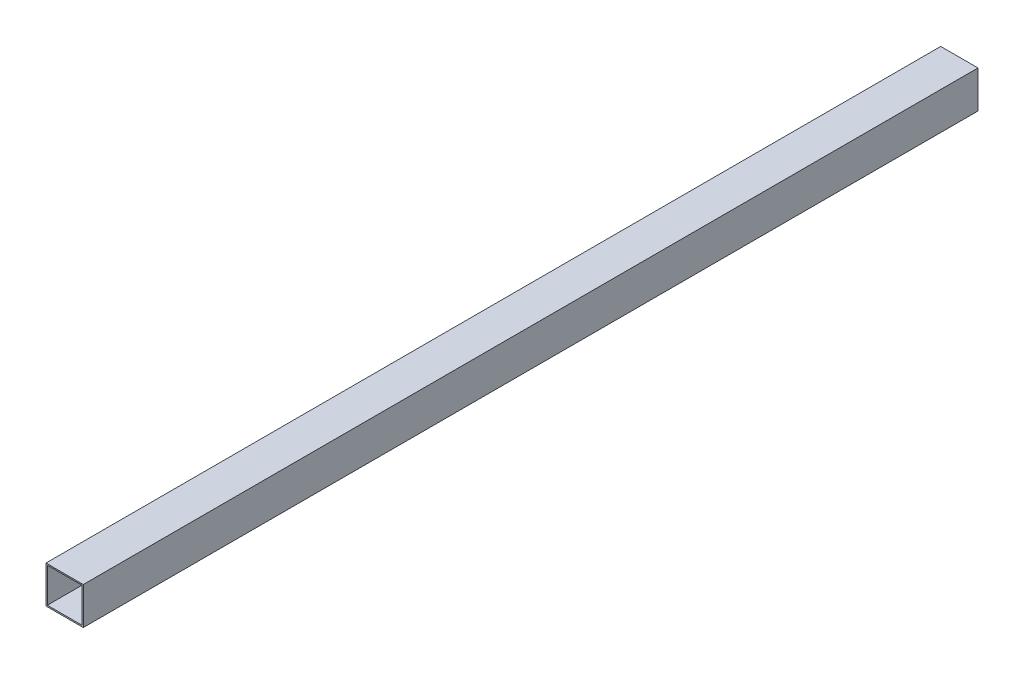
ISO-10303-21;
HEADER;
FILE_DESCRIPTION(('STEP AP214'),'2;1');
FILE_NAME('part.step','',(''),(''),'','','');
FILE_SCHEMA(('AUTOMOTIVE_DESIGN { 1 0 10303 214 1 1 1 1 }'));
ENDSEC;
DATA;
#1=APPLICATION_CONTEXT('core data for automotive mechanical design processes');
#2=APPLICATION_PROTOCOL_DEFINITION('international standard','automotive_design',2000,#1);
#3=PRODUCT_CONTEXT('',#1,'mechanical');
#4=PRODUCT('Part','Part','',(#3));
#5=PRODUCT_RELATED_PRODUCT_CATEGORY('part','',(#4));
#6=PRODUCT_DEFINITION_FORMATION('','',#4);
#7=PRODUCT_DEFINITION_CONTEXT('part definition',#1,'design');
#8=PRODUCT_DEFINITION('design','',#6,#7);
#9=PRODUCT_DEFINITION_SHAPE('','',#8);
#10=(LENGTH_UNIT() NAMED_UNIT(*) SI_UNIT(.MILLI.,.METRE.));
#11=(NAMED_UNIT(*) PLANE_ANGLE_UNIT() SI_UNIT($,.RADIAN.));
#12=(NAMED_UNIT(*) SI_UNIT($,.STERADIAN.) SOLID_ANGLE_UNIT());
#13=UNCERTAINTY_MEASURE_WITH_UNIT(LENGTH_MEASURE(1.E-05),#10,'distance_accuracy_value','');
#14=(GEOMETRIC_REPRESENTATION_CONTEXT(3) GLOBAL_UNCERTAINTY_ASSIGNED_CONTEXT((#13)) GLOBAL_UNIT_ASSIGNED_CONTEXT((#10,
#11,#12)) REPRESENTATION_CONTEXT('',''));
#15=CARTESIAN_POINT('',(0.,0.,0.));
#16=DIRECTION('',(0.,0.,1.));
#17=DIRECTION('',(1.,0.,0.));
#18=AXIS2_PLACEMENT_3D('',#15,#16,#17);
#19=CARTESIAN_POINT('',(-16.7874934818428,20.0303060807414,609.6));
#20=DIRECTION('',(1.,0.,0.));
#21=DIRECTION('',(0.,0.,-1.));
#22=AXIS2_PLACEMENT_3D('',#19,#20,#21);
#23=PLANE('',#22);
#24=DIRECTION('',(0.,-1.,0.));
#25=VECTOR('',#24,1.);
#26=CARTESIAN_POINT('',(-16.7874934818428,20.0303060807414,0.));
#27=LINE('',#26,#25);
#28=CARTESIAN_POINT('',(-16.7874934818428,20.0303060807414,0.));
#29=VERTEX_POINT('',#28);
#30=CARTESIAN_POINT('',(-16.7874934818428,-5.36969391925859,0.));
#31=VERTEX_POINT('',#30);
#32=EDGE_CURVE('E130',#29,#31,#27,.T.);
#33=ORIENTED_EDGE('',*,*,#32,.T.);
#34=DIRECTION('',(0.,0.,-1.));
#35=VECTOR('',#34,1.);
#36=CARTESIAN_POINT('',(-16.7874934818428,-5.36969391925859,609.6));
#37=LINE('',#36,#35);
#38=CARTESIAN_POINT('',(-16.7874934818428,-5.36969391925859,609.6));
#39=VERTEX_POINT('',#38);
#40=EDGE_CURVE('E11',#39,#31,#37,.T.);
#41=ORIENTED_EDGE('',*,*,#40,.F.);
#42=DIRECTION('',(0.,-1.,0.));
#43=VECTOR('',#42,1.);
#44=CARTESIAN_POINT('',(-16.7874934818428,20.0303060807414,609.6));
#45=LINE('',#44,#43);
#46=CARTESIAN_POINT('',(-16.7874934818428,20.0303060807414,609.6));
#47=VERTEX_POINT('',#46);
#48=EDGE_CURVE('E134',#47,#39,#45,.T.);
#49=ORIENTED_EDGE('',*,*,#48,.F.);
#50=DIRECTION('',(0.,0.,-1.));
#51=VECTOR('',#50,1.);
#52=CARTESIAN_POINT('',(-16.7874934818428,20.0303060807414,609.6));
#53=LINE('',#52,#51);
#54=EDGE_CURVE('E144',#47,#29,#53,.T.);
#55=ORIENTED_EDGE('',*,*,#54,.T.);
#56=EDGE_LOOP('',(#33,#41,#49,#55));
#57=FACE_BOUND('',#56,.T.);
#58=ADVANCED_FACE('F33',(#57),#23,.F.);
#59=CARTESIAN_POINT('',(-16.7874934818428,-5.36969391925859,609.6));
#60=DIRECTION('',(0.,1.,0.));
#61=DIRECTION('',(0.,0.,1.));
#62=AXIS2_PLACEMENT_3D('',#59,#60,#61);
#63=PLANE('',#62);
#64=DIRECTION('',(1.,0.,0.));
#65=VECTOR('',#64,1.);
#66=CARTESIAN_POINT('',(-16.7874934818428,-5.36969391925859,0.));
#67=LINE('',#66,#65);
#68=CARTESIAN_POINT('',(8.61250651815717,-5.36969391925859,0.));
#69=VERTEX_POINT('',#68);
#70=EDGE_CURVE('E147',#31,#69,#67,.T.);
#71=ORIENTED_EDGE('',*,*,#70,.T.);
#72=DIRECTION('',(0.,0.,-1.));
#73=VECTOR('',#72,1.);
#74=CARTESIAN_POINT('',(8.61250651815717,-5.36969391925859,609.6));
#75=LINE('',#74,#73);
#76=CARTESIAN_POINT('',(8.61250651815717,-5.36969391925859,609.6));
#77=VERTEX_POINT('',#76);
#78=EDGE_CURVE('E40',#77,#69,#75,.T.);
#79=ORIENTED_EDGE('',*,*,#78,.F.);
#80=DIRECTION('',(1.,0.,0.));
#81=VECTOR('',#80,1.);
#82=CARTESIAN_POINT('',(-16.7874934818428,-5.36969391925859,609.6));
#83=LINE('',#82,#81);
#84=EDGE_CURVE('E137',#39,#77,#83,.T.);
#85=ORIENTED_EDGE('',*,*,#84,.F.);
#86=ORIENTED_EDGE('',*,*,#40,.T.);
#87=EDGE_LOOP('',(#71,#79,#85,#86));
#88=FACE_BOUND('',#87,.T.);
#89=ADVANCED_FACE('F175',(#88),#63,.F.);
#90=CARTESIAN_POINT('',(8.61250651815717,20.0303060807414,609.6));
#91=DIRECTION('',(-1.,0.,0.));
#92=DIRECTION('',(0.,0.,1.));
#93=AXIS2_PLACEMENT_3D('',#90,#91,#92);
#94=PLANE('',#93);
#95=DIRECTION('',(0.,1.,0.));
#96=VECTOR('',#95,1.);
#97=CARTESIAN_POINT('',(8.61250651815717,20.0303060807414,0.));
#98=LINE('',#97,#96);
#99=CARTESIAN_POINT('',(8.61250651815717,20.0303060807414,0.));
#100=VERTEX_POINT('',#99);
#101=EDGE_CURVE('E149',#69,#100,#98,.T.);
#102=ORIENTED_EDGE('',*,*,#101,.T.);
#103=DIRECTION('',(0.,0.,-1.));
#104=VECTOR('',#103,1.);
#105=CARTESIAN_POINT('',(8.61250651815717,20.0303060807414,609.6));
#106=LINE('',#105,#104);
#107=CARTESIAN_POINT('',(8.61250651815717,20.0303060807414,609.6));
#108=VERTEX_POINT('',#107);
#109=EDGE_CURVE('E154',#108,#100,#106,.T.);
#110=ORIENTED_EDGE('',*,*,#109,.F.);
#111=DIRECTION('',(0.,1.,0.));
#112=VECTOR('',#111,1.);
#113=CARTESIAN_POINT('',(8.61250651815717,20.0303060807414,609.6));
#114=LINE('',#113,#112);
#115=EDGE_CURVE('E140',#77,#108,#114,.T.);
#116=ORIENTED_EDGE('',*,*,#115,.F.);
#117=ORIENTED_EDGE('',*,*,#78,.T.);
#118=EDGE_LOOP('',(#102,#110,#116,#117));
#119=FACE_BOUND('',#118,.T.);
#120=ADVANCED_FACE('F161',(#119),#94,.F.);
#121=CARTESIAN_POINT('',(-16.7874934818428,20.0303060807414,609.6));
#122=DIRECTION('',(0.,-1.,0.));
#123=DIRECTION('',(0.,0.,-1.));
#124=AXIS2_PLACEMENT_3D('',#121,#122,#123);
#125=PLANE('',#124);
#126=DIRECTION('',(-1.,0.,0.));
#127=VECTOR('',#126,1.);
#128=CARTESIAN_POINT('',(-16.7874934818428,20.0303060807414,0.));
#129=LINE('',#128,#127);
#130=EDGE_CURVE('E138',#100,#29,#129,.T.);
#131=ORIENTED_EDGE('',*,*,#130,.T.);
#132=ORIENTED_EDGE('',*,*,#54,.F.);
#133=DIRECTION('',(-1.,0.,0.));
#134=VECTOR('',#133,1.);
#135=CARTESIAN_POINT('',(-16.7874934818428,20.0303060807414,609.6));
#136=LINE('',#135,#134);
#137=EDGE_CURVE('E142',#108,#47,#136,.T.);
#138=ORIENTED_EDGE('',*,*,#137,.F.);
#139=ORIENTED_EDGE('',*,*,#109,.T.);
#140=EDGE_LOOP('',(#131,#132,#138,#139));
#141=FACE_BOUND('',#140,.T.);
#142=ADVANCED_FACE('F168',(#141),#125,.F.);
#143=CARTESIAN_POINT('',(0.,0.,609.6));
#144=DIRECTION('',(0.,0.,1.));
#145=DIRECTION('',(1.,0.,0.));
#146=AXIS2_PLACEMENT_3D('',#143,#144,#145);
#147=PLANE('',#146);
#148=DIRECTION('',(0.,-1.,0.));
#149=VECTOR('',#148,1.);
#150=CARTESIAN_POINT('',(-15.874597175153,19.1607009295183,609.6));
#151=LINE('',#150,#149);
#152=CARTESIAN_POINT('',(-15.874597175153,19.1607009295183,609.6));
#153=VERTEX_POINT('',#152);
#154=CARTESIAN_POINT('',(-15.874597175153,-4.42879254106998,609.6));
#155=VERTEX_POINT('',#154);
#156=EDGE_CURVE('E47',#153,#155,#151,.T.);
#157=ORIENTED_EDGE('',*,*,#156,.F.);
#158=DIRECTION('',(-1.,0.,0.));
#159=VECTOR('',#158,1.);
#160=CARTESIAN_POINT('',(-15.874597175153,19.1607009295183,609.6));
#161=LINE('',#160,#159);
#162=CARTESIAN_POINT('',(7.65605120904622,19.1607009295183,609.6));
#163=VERTEX_POINT('',#162);
#164=EDGE_CURVE('E115',#163,#153,#161,.T.);
#165=ORIENTED_EDGE('',*,*,#164,.F.);
#166=DIRECTION('',(0.,1.,0.));
#167=VECTOR('',#166,1.);
#168=CARTESIAN_POINT('',(7.65605120904622,19.1607009295183,609.6));
#169=LINE('',#168,#167);
#170=CARTESIAN_POINT('',(7.65605120904622,-4.42879254106998,609.6));
#171=VERTEX_POINT('',#170);
#172=EDGE_CURVE('E118',#171,#163,#169,.T.);
#173=ORIENTED_EDGE('',*,*,#172,.F.);
#174=DIRECTION('',(1.,0.,0.));
#175=VECTOR('',#174,1.);
#176=CARTESIAN_POINT('',(-15.874597175153,-4.42879254106998,609.6));
#177=LINE('',#176,#175);
#178=EDGE_CURVE('E124',#155,#171,#177,.T.);
#179=ORIENTED_EDGE('',*,*,#178,.F.);
#180=EDGE_LOOP('',(#157,#165,#173,#179));
#181=FACE_BOUND('',#180,.T.);
#182=ORIENTED_EDGE('',*,*,#48,.T.);
#183=ORIENTED_EDGE('',*,*,#84,.T.);
#184=ORIENTED_EDGE('',*,*,#115,.T.);
#185=ORIENTED_EDGE('',*,*,#137,.T.);
#186=EDGE_LOOP('',(#182,#183,#184,#185));
#187=FACE_BOUND('',#186,.T.);
#188=ADVANCED_FACE('F174',(#181,#187),#147,.T.);
#189=CARTESIAN_POINT('',(0.,0.,0.));
#190=DIRECTION('',(0.,0.,1.));
#191=DIRECTION('',(1.,0.,0.));
#192=AXIS2_PLACEMENT_3D('',#189,#190,#191);
#193=PLANE('',#192);
#194=DIRECTION('',(-1.,0.,0.));
#195=VECTOR('',#194,1.);
#196=CARTESIAN_POINT('',(-15.874597175153,19.1607009295183,0.));
#197=LINE('',#196,#195);
#198=CARTESIAN_POINT('',(7.65605120904622,19.1607009295183,0.));
#199=VERTEX_POINT('',#198);
#200=CARTESIAN_POINT('',(-15.874597175153,19.1607009295183,0.));
#201=VERTEX_POINT('',#200);
#202=EDGE_CURVE('E105',#199,#201,#197,.T.);
#203=ORIENTED_EDGE('',*,*,#202,.T.);
#204=DIRECTION('',(0.,-1.,0.));
#205=VECTOR('',#204,1.);
#206=CARTESIAN_POINT('',(-15.874597175153,19.1607009295183,0.));
#207=LINE('',#206,#205);
#208=CARTESIAN_POINT('',(-15.874597175153,-4.42879254106998,0.));
#209=VERTEX_POINT('',#208);
#210=EDGE_CURVE('E99',#201,#209,#207,.T.);
#211=ORIENTED_EDGE('',*,*,#210,.T.);
#212=DIRECTION('',(1.,0.,0.));
#213=VECTOR('',#212,1.);
#214=CARTESIAN_POINT('',(-15.874597175153,-4.42879254106998,0.));
#215=LINE('',#214,#213);
#216=CARTESIAN_POINT('',(7.65605120904622,-4.42879254106998,0.));
#217=VERTEX_POINT('',#216);
#218=EDGE_CURVE('E108',#209,#217,#215,.T.);
#219=ORIENTED_EDGE('',*,*,#218,.T.);
#220=DIRECTION('',(0.,1.,0.));
#221=VECTOR('',#220,1.);
#222=CARTESIAN_POINT('',(7.65605120904622,19.1607009295183,0.));
#223=LINE('',#222,#221);
#224=EDGE_CURVE('E55',#217,#199,#223,.T.);
#225=ORIENTED_EDGE('',*,*,#224,.T.);
#226=EDGE_LOOP('',(#203,#211,#219,#225));
#227=FACE_BOUND('',#226,.T.);
#228=ORIENTED_EDGE('',*,*,#32,.F.);
#229=ORIENTED_EDGE('',*,*,#130,.F.);
#230=ORIENTED_EDGE('',*,*,#101,.F.);
#231=ORIENTED_EDGE('',*,*,#70,.F.);
#232=EDGE_LOOP('',(#228,#229,#230,#231));
#233=FACE_BOUND('',#232,.T.);
#234=ADVANCED_FACE('F112',(#227,#233),#193,.F.);
#235=CARTESIAN_POINT('',(-15.874597175153,19.1607009295183,0.));
#236=DIRECTION('',(-1.,0.,0.));
#237=DIRECTION('',(0.,0.,1.));
#238=AXIS2_PLACEMENT_3D('',#235,#236,#237);
#239=PLANE('',#238);
#240=ORIENTED_EDGE('',*,*,#156,.T.);
#241=DIRECTION('',(0.,0.,1.));
#242=VECTOR('',#241,1.);
#243=CARTESIAN_POINT('',(-15.874597175153,-4.42879254106998,0.));
#244=LINE('',#243,#242);
#245=EDGE_CURVE('E95',#209,#155,#244,.T.);
#246=ORIENTED_EDGE('',*,*,#245,.F.);
#247=ORIENTED_EDGE('',*,*,#210,.F.);
#248=DIRECTION('',(0.,0.,1.));
#249=VECTOR('',#248,1.);
#250=CARTESIAN_POINT('',(-15.874597175153,19.1607009295183,0.));
#251=LINE('',#250,#249);
#252=EDGE_CURVE('E128',#201,#153,#251,.T.);
#253=ORIENTED_EDGE('',*,*,#252,.T.);
#254=EDGE_LOOP('',(#240,#246,#247,#253));
#255=FACE_BOUND('',#254,.T.);
#256=ADVANCED_FACE('F97',(#255),#239,.F.);
#257=CARTESIAN_POINT('',(-15.874597175153,19.1607009295183,0.));
#258=DIRECTION('',(0.,1.,0.));
#259=DIRECTION('',(0.,0.,1.));
#260=AXIS2_PLACEMENT_3D('',#257,#258,#259);
#261=PLANE('',#260);
#262=ORIENTED_EDGE('',*,*,#164,.T.);
#263=ORIENTED_EDGE('',*,*,#252,.F.);
#264=ORIENTED_EDGE('',*,*,#202,.F.);
#265=DIRECTION('',(0.,0.,1.));
#266=VECTOR('',#265,1.);
#267=CARTESIAN_POINT('',(7.65605120904622,19.1607009295183,0.));
#268=LINE('',#267,#266);
#269=EDGE_CURVE('E131',#199,#163,#268,.T.);
#270=ORIENTED_EDGE('',*,*,#269,.T.);
#271=EDGE_LOOP('',(#262,#263,#264,#270));
#272=FACE_BOUND('',#271,.T.);
#273=ADVANCED_FACE('F192',(#272),#261,.F.);
#274=CARTESIAN_POINT('',(7.65605120904622,19.1607009295183,0.));
#275=DIRECTION('',(1.,0.,0.));
#276=DIRECTION('',(0.,0.,-1.));
#277=AXIS2_PLACEMENT_3D('',#274,#275,#276);
#278=PLANE('',#277);
#279=ORIENTED_EDGE('',*,*,#172,.T.);
#280=ORIENTED_EDGE('',*,*,#269,.F.);
#281=ORIENTED_EDGE('',*,*,#224,.F.);
#282=DIRECTION('',(0.,0.,1.));
#283=VECTOR('',#282,1.);
#284=CARTESIAN_POINT('',(7.65605120904622,-4.42879254106998,0.));
#285=LINE('',#284,#283);
#286=EDGE_CURVE('E104',#217,#171,#285,.T.);
#287=ORIENTED_EDGE('',*,*,#286,.T.);
#288=EDGE_LOOP('',(#279,#280,#281,#287));
#289=FACE_BOUND('',#288,.T.);
#290=ADVANCED_FACE('F195',(#289),#278,.F.);
#291=CARTESIAN_POINT('',(-15.874597175153,-4.42879254106998,0.));
#292=DIRECTION('',(0.,-1.,0.));
#293=DIRECTION('',(0.,0.,-1.));
#294=AXIS2_PLACEMENT_3D('',#291,#292,#293);
#295=PLANE('',#294);
#296=ORIENTED_EDGE('',*,*,#178,.T.);
#297=ORIENTED_EDGE('',*,*,#286,.F.);
#298=ORIENTED_EDGE('',*,*,#218,.F.);
#299=ORIENTED_EDGE('',*,*,#245,.T.);
#300=EDGE_LOOP('',(#296,#297,#298,#299));
#301=FACE_BOUND('',#300,.T.);
#302=ADVANCED_FACE('F109',(#301),#295,.F.);
#303=CLOSED_SHELL('',(#58,#89,#120,#142,#188,#234,#256,#273,#290,#302));
#304=MANIFOLD_SOLID_BREP('B2',#303);
#305=ADVANCED_BREP_SHAPE_REPRESENTATION('',(#18,#304),#14);
#306=SHAPE_DEFINITION_REPRESENTATION(#9,#305);
ENDSEC;
END-ISO-10303-21;
